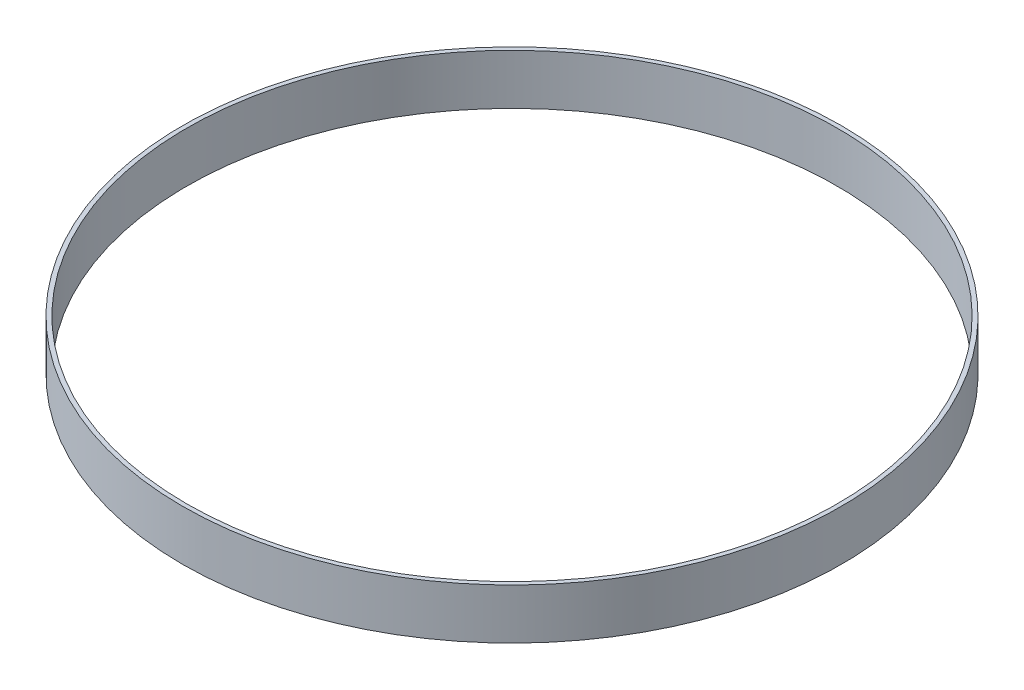
ISO-10303-21;
HEADER;
FILE_DESCRIPTION(('STEP AP214'),'2;1');
FILE_NAME('part.step','',(''),(''),'','','');
FILE_SCHEMA(('AUTOMOTIVE_DESIGN { 1 0 10303 214 1 1 1 1 }'));
ENDSEC;
DATA;
#1=APPLICATION_CONTEXT('core data for automotive mechanical design processes');
#2=APPLICATION_PROTOCOL_DEFINITION('international standard','automotive_design',2000,#1);
#3=PRODUCT_CONTEXT('',#1,'mechanical');
#4=PRODUCT('Part','Part','',(#3));
#5=PRODUCT_RELATED_PRODUCT_CATEGORY('part','',(#4));
#6=PRODUCT_DEFINITION_FORMATION('','',#4);
#7=PRODUCT_DEFINITION_CONTEXT('part definition',#1,'design');
#8=PRODUCT_DEFINITION('design','',#6,#7);
#9=PRODUCT_DEFINITION_SHAPE('','',#8);
#10=(LENGTH_UNIT() NAMED_UNIT(*) SI_UNIT(.MILLI.,.METRE.));
#11=(NAMED_UNIT(*) PLANE_ANGLE_UNIT() SI_UNIT($,.RADIAN.));
#12=(NAMED_UNIT(*) SI_UNIT($,.STERADIAN.) SOLID_ANGLE_UNIT());
#13=UNCERTAINTY_MEASURE_WITH_UNIT(LENGTH_MEASURE(1.E-05),#10,'distance_accuracy_value','');
#14=(GEOMETRIC_REPRESENTATION_CONTEXT(3) GLOBAL_UNCERTAINTY_ASSIGNED_CONTEXT((#13)) GLOBAL_UNIT_ASSIGNED_CONTEXT((#10,
#11,#12)) REPRESENTATION_CONTEXT('',''));
#15=CARTESIAN_POINT('',(0.,0.,0.));
#16=DIRECTION('',(0.,0.,1.));
#17=DIRECTION('',(1.,0.,0.));
#18=AXIS2_PLACEMENT_3D('',#15,#16,#17);
#19=CARTESIAN_POINT('',(0.,6.,0.));
#20=DIRECTION('',(0.,1.,0.));
#21=DIRECTION('',(0.,0.,1.));
#22=AXIS2_PLACEMENT_3D('',#19,#20,#21);
#23=PLANE('',#22);
#24=CARTESIAN_POINT('',(0.,6.,0.));
#25=DIRECTION('',(0.,1.,0.));
#26=DIRECTION('',(0.,0.,1.));
#27=AXIS2_PLACEMENT_3D('',#24,#25,#26);
#28=CIRCLE('',#27,39.3);
#29=CARTESIAN_POINT('',(0.,6.,39.3));
#30=VERTEX_POINT('',#29);
#31=EDGE_CURVE('E10',#30,#30,#28,.T.);
#32=ORIENTED_EDGE('',*,*,#31,.T.);
#33=EDGE_LOOP('',(#32));
#34=FACE_BOUND('',#33,.T.);
#35=CARTESIAN_POINT('',(0.,6.,0.));
#36=DIRECTION('',(0.,1.,0.));
#37=DIRECTION('',(0.,0.,1.));
#38=AXIS2_PLACEMENT_3D('',#35,#36,#37);
#39=CIRCLE('',#38,38.8);
#40=CARTESIAN_POINT('',(0.,6.,38.8));
#41=VERTEX_POINT('',#40);
#42=EDGE_CURVE('E54',#41,#41,#39,.T.);
#43=ORIENTED_EDGE('',*,*,#42,.F.);
#44=EDGE_LOOP('',(#43));
#45=FACE_BOUND('',#44,.T.);
#46=ADVANCED_FACE('F41',(#34,#45),#23,.T.);
#47=CARTESIAN_POINT('',(0.,0.,0.));
#48=DIRECTION('',(0.,1.,0.));
#49=DIRECTION('',(0.,0.,1.));
#50=AXIS2_PLACEMENT_3D('',#47,#48,#49);
#51=PLANE('',#50);
#52=CARTESIAN_POINT('',(0.,0.,0.));
#53=DIRECTION('',(0.,1.,0.));
#54=DIRECTION('',(0.,0.,1.));
#55=AXIS2_PLACEMENT_3D('',#52,#53,#54);
#56=CIRCLE('',#55,39.3);
#57=CARTESIAN_POINT('',(0.,0.,39.3));
#58=VERTEX_POINT('',#57);
#59=EDGE_CURVE('E45',#58,#58,#56,.T.);
#60=ORIENTED_EDGE('',*,*,#59,.F.);
#61=EDGE_LOOP('',(#60));
#62=FACE_BOUND('',#61,.T.);
#63=CARTESIAN_POINT('',(0.,0.,0.));
#64=DIRECTION('',(0.,1.,0.));
#65=DIRECTION('',(0.,0.,1.));
#66=AXIS2_PLACEMENT_3D('',#63,#64,#65);
#67=CIRCLE('',#66,38.8);
#68=CARTESIAN_POINT('',(0.,0.,38.8));
#69=VERTEX_POINT('',#68);
#70=EDGE_CURVE('E56',#69,#69,#67,.T.);
#71=ORIENTED_EDGE('',*,*,#70,.T.);
#72=EDGE_LOOP('',(#71));
#73=FACE_BOUND('',#72,.T.);
#74=ADVANCED_FACE('F68',(#62,#73),#51,.F.);
#75=CARTESIAN_POINT('',(0.,6.,0.));
#76=DIRECTION('',(0.,-1.,0.));
#77=DIRECTION('',(0.,0.,-1.));
#78=AXIS2_PLACEMENT_3D('',#75,#76,#77);
#79=CYLINDRICAL_SURFACE('',#78,39.3);
#80=ORIENTED_EDGE('',*,*,#31,.F.);
#81=EDGE_LOOP('',(#80));
#82=FACE_BOUND('',#81,.T.);
#83=ORIENTED_EDGE('',*,*,#59,.T.);
#84=EDGE_LOOP('',(#83));
#85=FACE_BOUND('',#84,.T.);
#86=ADVANCED_FACE('F43',(#82,#85),#79,.T.);
#87=CARTESIAN_POINT('',(0.,6.,0.));
#88=DIRECTION('',(0.,-1.,0.));
#89=DIRECTION('',(0.,0.,-1.));
#90=AXIS2_PLACEMENT_3D('',#87,#88,#89);
#91=CYLINDRICAL_SURFACE('',#90,38.8);
#92=ORIENTED_EDGE('',*,*,#42,.T.);
#93=EDGE_LOOP('',(#92));
#94=FACE_BOUND('',#93,.T.);
#95=ORIENTED_EDGE('',*,*,#70,.F.);
#96=EDGE_LOOP('',(#95));
#97=FACE_BOUND('',#96,.T.);
#98=ADVANCED_FACE('F64',(#94,#97),#91,.F.);
#99=CLOSED_SHELL('',(#46,#74,#86,#98));
#100=MANIFOLD_SOLID_BREP('B2',#99);
#101=ADVANCED_BREP_SHAPE_REPRESENTATION('',(#18,#100),#14);
#102=SHAPE_DEFINITION_REPRESENTATION(#9,#101);
ENDSEC;
END-ISO-10303-21;
